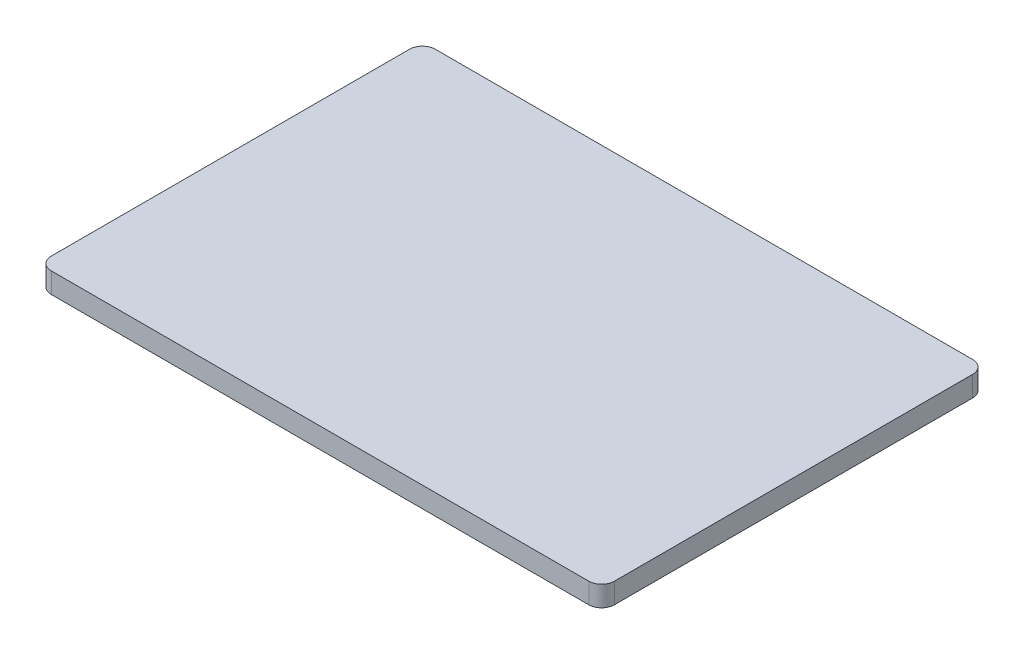
ISO-10303-21;
HEADER;
FILE_DESCRIPTION(('STEP AP214'),'2;1');
FILE_NAME('part.step','',(''),(''),'','','');
FILE_SCHEMA(('AUTOMOTIVE_DESIGN { 1 0 10303 214 1 1 1 1 }'));
ENDSEC;
DATA;
#1=APPLICATION_CONTEXT('core data for automotive mechanical design processes');
#2=APPLICATION_PROTOCOL_DEFINITION('international standard','automotive_design',2000,#1);
#3=PRODUCT_CONTEXT('',#1,'mechanical');
#4=PRODUCT('Part','Part','',(#3));
#5=PRODUCT_RELATED_PRODUCT_CATEGORY('part','',(#4));
#6=PRODUCT_DEFINITION_FORMATION('','',#4);
#7=PRODUCT_DEFINITION_CONTEXT('part definition',#1,'design');
#8=PRODUCT_DEFINITION('design','',#6,#7);
#9=PRODUCT_DEFINITION_SHAPE('','',#8);
#10=(LENGTH_UNIT() NAMED_UNIT(*) SI_UNIT(.MILLI.,.METRE.));
#11=(NAMED_UNIT(*) PLANE_ANGLE_UNIT() SI_UNIT($,.RADIAN.));
#12=(NAMED_UNIT(*) SI_UNIT($,.STERADIAN.) SOLID_ANGLE_UNIT());
#13=UNCERTAINTY_MEASURE_WITH_UNIT(LENGTH_MEASURE(1.E-05),#10,'distance_accuracy_value','');
#14=(GEOMETRIC_REPRESENTATION_CONTEXT(3) GLOBAL_UNCERTAINTY_ASSIGNED_CONTEXT((#13)) GLOBAL_UNIT_ASSIGNED_CONTEXT((#10,
#11,#12)) REPRESENTATION_CONTEXT('',''));
#15=CARTESIAN_POINT('',(0.,0.,0.));
#16=DIRECTION('',(0.,0.,1.));
#17=DIRECTION('',(1.,0.,0.));
#18=AXIS2_PLACEMENT_3D('',#15,#16,#17);
#19=CARTESIAN_POINT('',(110.,4.,75.));
#20=DIRECTION('',(-1.,0.,0.));
#21=DIRECTION('',(0.,0.,1.));
#22=AXIS2_PLACEMENT_3D('',#19,#20,#21);
#23=PLANE('',#22);
#24=DIRECTION('',(0.,0.,-1.));
#25=VECTOR('',#24,1.);
#26=CARTESIAN_POINT('',(110.,-4.,75.));
#27=LINE('',#26,#25);
#28=CARTESIAN_POINT('',(110.,-4.,70.));
#29=VERTEX_POINT('',#28);
#30=CARTESIAN_POINT('',(110.,-4.,-70.));
#31=VERTEX_POINT('',#30);
#32=EDGE_CURVE('E130',#29,#31,#27,.T.);
#33=ORIENTED_EDGE('',*,*,#32,.T.);
#34=DIRECTION('',(0.,-1.,0.));
#35=VECTOR('',#34,1.);
#36=CARTESIAN_POINT('',(110.,4.,-70.));
#37=LINE('',#36,#35);
#38=CARTESIAN_POINT('',(110.,4.,-70.));
#39=VERTEX_POINT('',#38);
#40=EDGE_CURVE('E108',#31,#39,#37,.F.);
#41=ORIENTED_EDGE('',*,*,#40,.T.);
#42=DIRECTION('',(0.,0.,-1.));
#43=VECTOR('',#42,1.);
#44=CARTESIAN_POINT('',(110.,4.,75.));
#45=LINE('',#44,#43);
#46=CARTESIAN_POINT('',(110.,4.,70.));
#47=VERTEX_POINT('',#46);
#48=EDGE_CURVE('E139',#47,#39,#45,.T.);
#49=ORIENTED_EDGE('',*,*,#48,.F.);
#50=DIRECTION('',(0.,-1.,0.));
#51=VECTOR('',#50,1.);
#52=CARTESIAN_POINT('',(110.,4.,70.));
#53=LINE('',#52,#51);
#54=EDGE_CURVE('E113',#47,#29,#53,.T.);
#55=ORIENTED_EDGE('',*,*,#54,.T.);
#56=EDGE_LOOP('',(#33,#41,#49,#55));
#57=FACE_BOUND('',#56,.T.);
#58=ADVANCED_FACE('F37',(#57),#23,.F.);
#59=CARTESIAN_POINT('',(-110.,4.,-75.));
#60=DIRECTION('',(0.,0.,1.));
#61=DIRECTION('',(1.,0.,0.));
#62=AXIS2_PLACEMENT_3D('',#59,#60,#61);
#63=PLANE('',#62);
#64=DIRECTION('',(-1.,0.,0.));
#65=VECTOR('',#64,1.);
#66=CARTESIAN_POINT('',(-110.,4.,-75.));
#67=LINE('',#66,#65);
#68=CARTESIAN_POINT('',(105.,4.,-75.));
#69=VERTEX_POINT('',#68);
#70=CARTESIAN_POINT('',(-105.,4.,-75.));
#71=VERTEX_POINT('',#70);
#72=EDGE_CURVE('E123',#69,#71,#67,.T.);
#73=ORIENTED_EDGE('',*,*,#72,.F.);
#74=DIRECTION('',(0.,-1.,0.));
#75=VECTOR('',#74,1.);
#76=CARTESIAN_POINT('',(105.,4.,-75.));
#77=LINE('',#76,#75);
#78=CARTESIAN_POINT('',(105.,-4.,-75.));
#79=VERTEX_POINT('',#78);
#80=EDGE_CURVE('E107',#69,#79,#77,.T.);
#81=ORIENTED_EDGE('',*,*,#80,.T.);
#82=DIRECTION('',(-1.,0.,0.));
#83=VECTOR('',#82,1.);
#84=CARTESIAN_POINT('',(-110.,-4.,-75.));
#85=LINE('',#84,#83);
#86=CARTESIAN_POINT('',(-105.,-4.,-75.));
#87=VERTEX_POINT('',#86);
#88=EDGE_CURVE('E120',#79,#87,#85,.T.);
#89=ORIENTED_EDGE('',*,*,#88,.T.);
#90=DIRECTION('',(0.,-1.,0.));
#91=VECTOR('',#90,1.);
#92=CARTESIAN_POINT('',(-105.,4.,-75.));
#93=LINE('',#92,#91);
#94=EDGE_CURVE('E125',#87,#71,#93,.F.);
#95=ORIENTED_EDGE('',*,*,#94,.T.);
#96=EDGE_LOOP('',(#73,#81,#89,#95));
#97=FACE_BOUND('',#96,.T.);
#98=ADVANCED_FACE('F119',(#97),#63,.F.);
#99=CARTESIAN_POINT('',(-110.,4.,75.));
#100=DIRECTION('',(1.,0.,0.));
#101=DIRECTION('',(0.,0.,-1.));
#102=AXIS2_PLACEMENT_3D('',#99,#100,#101);
#103=PLANE('',#102);
#104=DIRECTION('',(0.,0.,1.));
#105=VECTOR('',#104,1.);
#106=CARTESIAN_POINT('',(-110.,4.,75.));
#107=LINE('',#106,#105);
#108=CARTESIAN_POINT('',(-110.,4.,-70.));
#109=VERTEX_POINT('',#108);
#110=CARTESIAN_POINT('',(-110.,4.,70.));
#111=VERTEX_POINT('',#110);
#112=EDGE_CURVE('E165',#109,#111,#107,.T.);
#113=ORIENTED_EDGE('',*,*,#112,.F.);
#114=DIRECTION('',(0.,-1.,0.));
#115=VECTOR('',#114,1.);
#116=CARTESIAN_POINT('',(-110.,4.,-70.));
#117=LINE('',#116,#115);
#118=CARTESIAN_POINT('',(-110.,-4.,-70.));
#119=VERTEX_POINT('',#118);
#120=EDGE_CURVE('E158',#109,#119,#117,.T.);
#121=ORIENTED_EDGE('',*,*,#120,.T.);
#122=DIRECTION('',(0.,0.,1.));
#123=VECTOR('',#122,1.);
#124=CARTESIAN_POINT('',(-110.,-4.,75.));
#125=LINE('',#124,#123);
#126=CARTESIAN_POINT('',(-110.,-4.,70.));
#127=VERTEX_POINT('',#126);
#128=EDGE_CURVE('E129',#119,#127,#125,.T.);
#129=ORIENTED_EDGE('',*,*,#128,.T.);
#130=DIRECTION('',(0.,-1.,0.));
#131=VECTOR('',#130,1.);
#132=CARTESIAN_POINT('',(-110.,4.,70.));
#133=LINE('',#132,#131);
#134=EDGE_CURVE('E156',#127,#111,#133,.F.);
#135=ORIENTED_EDGE('',*,*,#134,.T.);
#136=EDGE_LOOP('',(#113,#121,#129,#135));
#137=FACE_BOUND('',#136,.T.);
#138=ADVANCED_FACE('F163',(#137),#103,.F.);
#139=CARTESIAN_POINT('',(-110.,4.,75.));
#140=DIRECTION('',(0.,0.,-1.));
#141=DIRECTION('',(-1.,0.,0.));
#142=AXIS2_PLACEMENT_3D('',#139,#140,#141);
#143=PLANE('',#142);
#144=DIRECTION('',(1.,0.,0.));
#145=VECTOR('',#144,1.);
#146=CARTESIAN_POINT('',(-110.,4.,75.));
#147=LINE('',#146,#145);
#148=CARTESIAN_POINT('',(-105.,4.,75.));
#149=VERTEX_POINT('',#148);
#150=CARTESIAN_POINT('',(105.,4.,75.));
#151=VERTEX_POINT('',#150);
#152=EDGE_CURVE('E140',#149,#151,#147,.T.);
#153=ORIENTED_EDGE('',*,*,#152,.F.);
#154=DIRECTION('',(0.,-1.,0.));
#155=VECTOR('',#154,1.);
#156=CARTESIAN_POINT('',(-105.,4.,75.));
#157=LINE('',#156,#155);
#158=CARTESIAN_POINT('',(-105.,-4.,75.));
#159=VERTEX_POINT('',#158);
#160=EDGE_CURVE('E11',#149,#159,#157,.T.);
#161=ORIENTED_EDGE('',*,*,#160,.T.);
#162=DIRECTION('',(1.,0.,0.));
#163=VECTOR('',#162,1.);
#164=CARTESIAN_POINT('',(-110.,-4.,75.));
#165=LINE('',#164,#163);
#166=CARTESIAN_POINT('',(105.,-4.,75.));
#167=VERTEX_POINT('',#166);
#168=EDGE_CURVE('E133',#159,#167,#165,.T.);
#169=ORIENTED_EDGE('',*,*,#168,.T.);
#170=DIRECTION('',(0.,-1.,0.));
#171=VECTOR('',#170,1.);
#172=CARTESIAN_POINT('',(105.,4.,75.));
#173=LINE('',#172,#171);
#174=EDGE_CURVE('E45',#167,#151,#173,.F.);
#175=ORIENTED_EDGE('',*,*,#174,.T.);
#176=EDGE_LOOP('',(#153,#161,#169,#175));
#177=FACE_BOUND('',#176,.T.);
#178=ADVANCED_FACE('F172',(#177),#143,.F.);
#179=CARTESIAN_POINT('',(0.,4.,0.));
#180=DIRECTION('',(0.,-1.,0.));
#181=DIRECTION('',(0.,0.,-1.));
#182=AXIS2_PLACEMENT_3D('',#179,#180,#181);
#183=PLANE('',#182);
#184=ORIENTED_EDGE('',*,*,#48,.T.);
#185=CARTESIAN_POINT('',(105.,4.,-70.));
#186=DIRECTION('',(0.,-1.,0.));
#187=DIRECTION('',(0.,0.,-1.));
#188=AXIS2_PLACEMENT_3D('',#185,#186,#187);
#189=CIRCLE('',#188,5.);
#190=EDGE_CURVE('E154',#39,#69,#189,.F.);
#191=ORIENTED_EDGE('',*,*,#190,.T.);
#192=ORIENTED_EDGE('',*,*,#72,.T.);
#193=CARTESIAN_POINT('',(-105.,4.,-70.));
#194=DIRECTION('',(0.,-1.,0.));
#195=DIRECTION('',(0.,0.,-1.));
#196=AXIS2_PLACEMENT_3D('',#193,#194,#195);
#197=CIRCLE('',#196,5.);
#198=EDGE_CURVE('E152',#71,#109,#197,.F.);
#199=ORIENTED_EDGE('',*,*,#198,.T.);
#200=ORIENTED_EDGE('',*,*,#112,.T.);
#201=CARTESIAN_POINT('',(-105.,4.,70.));
#202=DIRECTION('',(0.,-1.,0.));
#203=DIRECTION('',(0.,0.,-1.));
#204=AXIS2_PLACEMENT_3D('',#201,#202,#203);
#205=CIRCLE('',#204,5.);
#206=EDGE_CURVE('E58',#111,#149,#205,.F.);
#207=ORIENTED_EDGE('',*,*,#206,.T.);
#208=ORIENTED_EDGE('',*,*,#152,.T.);
#209=CARTESIAN_POINT('',(105.,4.,70.));
#210=DIRECTION('',(0.,-1.,0.));
#211=DIRECTION('',(0.,0.,-1.));
#212=AXIS2_PLACEMENT_3D('',#209,#210,#211);
#213=CIRCLE('',#212,5.);
#214=EDGE_CURVE('E149',#151,#47,#213,.F.);
#215=ORIENTED_EDGE('',*,*,#214,.T.);
#216=EDGE_LOOP('',(#184,#191,#192,#199,#200,#207,#208,#215));
#217=FACE_BOUND('',#216,.T.);
#218=ADVANCED_FACE('F179',(#217),#183,.F.);
#219=CARTESIAN_POINT('',(0.,-4.,0.));
#220=DIRECTION('',(0.,-1.,0.));
#221=DIRECTION('',(0.,0.,-1.));
#222=AXIS2_PLACEMENT_3D('',#219,#220,#221);
#223=PLANE('',#222);
#224=ORIENTED_EDGE('',*,*,#88,.F.);
#225=CARTESIAN_POINT('',(105.,-4.,-70.));
#226=DIRECTION('',(0.,-1.,0.));
#227=DIRECTION('',(0.,0.,-1.));
#228=AXIS2_PLACEMENT_3D('',#225,#226,#227);
#229=CIRCLE('',#228,5.);
#230=EDGE_CURVE('E103',#79,#31,#229,.T.);
#231=ORIENTED_EDGE('',*,*,#230,.T.);
#232=ORIENTED_EDGE('',*,*,#32,.F.);
#233=CARTESIAN_POINT('',(105.,-4.,70.));
#234=DIRECTION('',(0.,-1.,0.));
#235=DIRECTION('',(0.,0.,-1.));
#236=AXIS2_PLACEMENT_3D('',#233,#234,#235);
#237=CIRCLE('',#236,5.);
#238=EDGE_CURVE('E124',#29,#167,#237,.T.);
#239=ORIENTED_EDGE('',*,*,#238,.T.);
#240=ORIENTED_EDGE('',*,*,#168,.F.);
#241=CARTESIAN_POINT('',(-105.,-4.,70.));
#242=DIRECTION('',(0.,-1.,0.));
#243=DIRECTION('',(0.,0.,-1.));
#244=AXIS2_PLACEMENT_3D('',#241,#242,#243);
#245=CIRCLE('',#244,5.);
#246=EDGE_CURVE('E143',#159,#127,#245,.T.);
#247=ORIENTED_EDGE('',*,*,#246,.T.);
#248=ORIENTED_EDGE('',*,*,#128,.F.);
#249=CARTESIAN_POINT('',(-105.,-4.,-70.));
#250=DIRECTION('',(0.,-1.,0.));
#251=DIRECTION('',(0.,0.,-1.));
#252=AXIS2_PLACEMENT_3D('',#249,#250,#251);
#253=CIRCLE('',#252,5.);
#254=EDGE_CURVE('E114',#119,#87,#253,.T.);
#255=ORIENTED_EDGE('',*,*,#254,.T.);
#256=EDGE_LOOP('',(#224,#231,#232,#239,#240,#247,#248,#255));
#257=FACE_BOUND('',#256,.T.);
#258=ADVANCED_FACE('F127',(#257),#223,.T.);
#259=CARTESIAN_POINT('',(105.,4.,-70.));
#260=DIRECTION('',(0.,-1.,0.));
#261=DIRECTION('',(0.,0.,-1.));
#262=AXIS2_PLACEMENT_3D('',#259,#260,#261);
#263=CYLINDRICAL_SURFACE('',#262,5.);
#264=ORIENTED_EDGE('',*,*,#190,.F.);
#265=ORIENTED_EDGE('',*,*,#40,.F.);
#266=ORIENTED_EDGE('',*,*,#230,.F.);
#267=ORIENTED_EDGE('',*,*,#80,.F.);
#268=EDGE_LOOP('',(#264,#265,#266,#267));
#269=FACE_BOUND('',#268,.T.);
#270=ADVANCED_FACE('F106',(#269),#263,.T.);
#271=CARTESIAN_POINT('',(-105.,4.,-70.));
#272=DIRECTION('',(0.,-1.,0.));
#273=DIRECTION('',(0.,0.,-1.));
#274=AXIS2_PLACEMENT_3D('',#271,#272,#273);
#275=CYLINDRICAL_SURFACE('',#274,5.);
#276=ORIENTED_EDGE('',*,*,#198,.F.);
#277=ORIENTED_EDGE('',*,*,#94,.F.);
#278=ORIENTED_EDGE('',*,*,#254,.F.);
#279=ORIENTED_EDGE('',*,*,#120,.F.);
#280=EDGE_LOOP('',(#276,#277,#278,#279));
#281=FACE_BOUND('',#280,.T.);
#282=ADVANCED_FACE('F187',(#281),#275,.T.);
#283=CARTESIAN_POINT('',(-105.,4.,70.));
#284=DIRECTION('',(0.,-1.,0.));
#285=DIRECTION('',(0.,0.,-1.));
#286=AXIS2_PLACEMENT_3D('',#283,#284,#285);
#287=CYLINDRICAL_SURFACE('',#286,5.);
#288=ORIENTED_EDGE('',*,*,#206,.F.);
#289=ORIENTED_EDGE('',*,*,#134,.F.);
#290=ORIENTED_EDGE('',*,*,#246,.F.);
#291=ORIENTED_EDGE('',*,*,#160,.F.);
#292=EDGE_LOOP('',(#288,#289,#290,#291));
#293=FACE_BOUND('',#292,.T.);
#294=ADVANCED_FACE('F171',(#293),#287,.T.);
#295=CARTESIAN_POINT('',(105.,4.,70.));
#296=DIRECTION('',(0.,-1.,0.));
#297=DIRECTION('',(0.,0.,-1.));
#298=AXIS2_PLACEMENT_3D('',#295,#296,#297);
#299=CYLINDRICAL_SURFACE('',#298,5.);
#300=ORIENTED_EDGE('',*,*,#214,.F.);
#301=ORIENTED_EDGE('',*,*,#174,.F.);
#302=ORIENTED_EDGE('',*,*,#238,.F.);
#303=ORIENTED_EDGE('',*,*,#54,.F.);
#304=EDGE_LOOP('',(#300,#301,#302,#303));
#305=FACE_BOUND('',#304,.T.);
#306=ADVANCED_FACE('F39',(#305),#299,.T.);
#307=CLOSED_SHELL('',(#58,#98,#138,#178,#218,#258,#270,#282,#294,#306));
#308=MANIFOLD_SOLID_BREP('B2',#307);
#309=ADVANCED_BREP_SHAPE_REPRESENTATION('',(#18,#308),#14);
#310=SHAPE_DEFINITION_REPRESENTATION(#9,#309);
ENDSEC;
END-ISO-10303-21;
